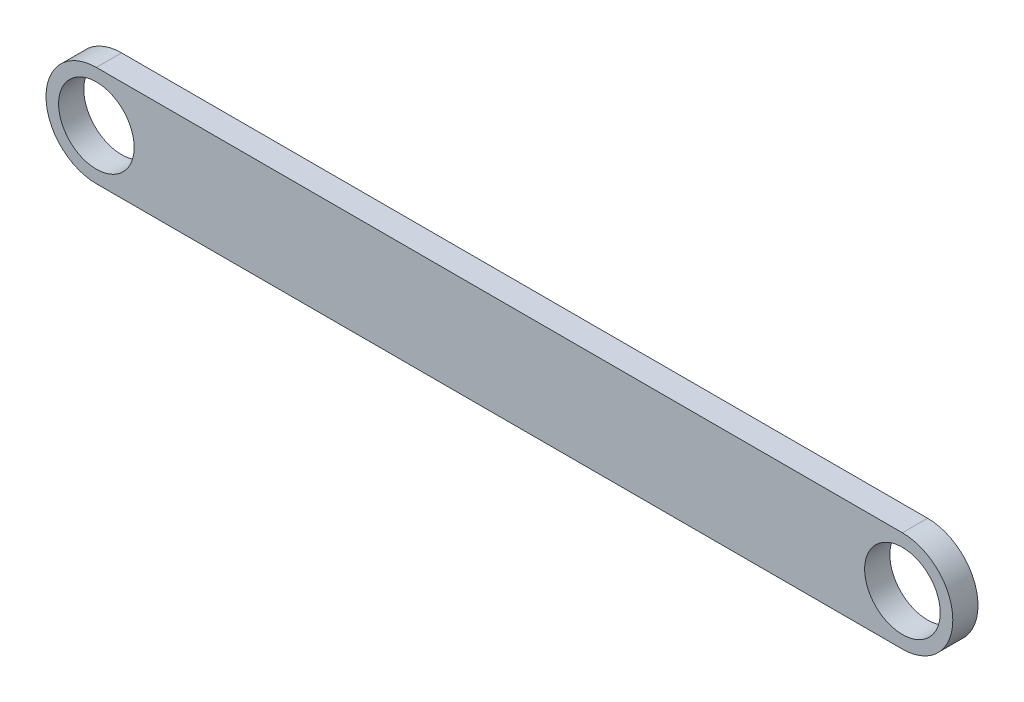
ISO-10303-21;
HEADER;
FILE_DESCRIPTION(('STEP AP214'),'2;1');
FILE_NAME('part.step','',(''),(''),'','','');
FILE_SCHEMA(('AUTOMOTIVE_DESIGN { 1 0 10303 214 1 1 1 1 }'));
ENDSEC;
DATA;
#1=APPLICATION_CONTEXT('core data for automotive mechanical design processes');
#2=APPLICATION_PROTOCOL_DEFINITION('international standard','automotive_design',2000,#1);
#3=PRODUCT_CONTEXT('',#1,'mechanical');
#4=PRODUCT('Part','Part','',(#3));
#5=PRODUCT_RELATED_PRODUCT_CATEGORY('part','',(#4));
#6=PRODUCT_DEFINITION_FORMATION('','',#4);
#7=PRODUCT_DEFINITION_CONTEXT('part definition',#1,'design');
#8=PRODUCT_DEFINITION('design','',#6,#7);
#9=PRODUCT_DEFINITION_SHAPE('','',#8);
#10=(LENGTH_UNIT() NAMED_UNIT(*) SI_UNIT(.MILLI.,.METRE.));
#11=(NAMED_UNIT(*) PLANE_ANGLE_UNIT() SI_UNIT($,.RADIAN.));
#12=(NAMED_UNIT(*) SI_UNIT($,.STERADIAN.) SOLID_ANGLE_UNIT());
#13=UNCERTAINTY_MEASURE_WITH_UNIT(LENGTH_MEASURE(1.E-05),#10,'distance_accuracy_value','');
#14=(GEOMETRIC_REPRESENTATION_CONTEXT(3) GLOBAL_UNCERTAINTY_ASSIGNED_CONTEXT((#13)) GLOBAL_UNIT_ASSIGNED_CONTEXT((#10,
#11,#12)) REPRESENTATION_CONTEXT('',''));
#15=CARTESIAN_POINT('',(0.,0.,0.));
#16=DIRECTION('',(0.,0.,1.));
#17=DIRECTION('',(1.,0.,0.));
#18=AXIS2_PLACEMENT_3D('',#15,#16,#17);
#19=CARTESIAN_POINT('',(0.,0.,10.));
#20=DIRECTION('',(0.,0.,1.));
#21=DIRECTION('',(1.,0.,0.));
#22=AXIS2_PLACEMENT_3D('',#19,#20,#21);
#23=PLANE('',#22);
#24=CARTESIAN_POINT('',(0.,0.,10.));
#25=DIRECTION('',(0.,0.,1.));
#26=DIRECTION('',(1.,0.,0.));
#27=AXIS2_PLACEMENT_3D('',#24,#25,#26);
#28=CIRCLE('',#27,15.);
#29=CARTESIAN_POINT('',(15.,0.,10.));
#30=VERTEX_POINT('',#29);
#31=EDGE_CURVE('E116',#30,#30,#28,.T.);
#32=ORIENTED_EDGE('',*,*,#31,.F.);
#33=EDGE_LOOP('',(#32));
#34=FACE_BOUND('',#33,.T.);
#35=CARTESIAN_POINT('',(0.,0.,10.));
#36=DIRECTION('',(0.,0.,1.));
#37=DIRECTION('',(1.,0.,0.));
#38=AXIS2_PLACEMENT_3D('',#35,#36,#37);
#39=CIRCLE('',#38,20.);
#40=CARTESIAN_POINT('',(0.,20.,10.));
#41=VERTEX_POINT('',#40);
#42=CARTESIAN_POINT('',(0.,-20.,10.));
#43=VERTEX_POINT('',#42);
#44=EDGE_CURVE('E96',#41,#43,#39,.T.);
#45=ORIENTED_EDGE('',*,*,#44,.T.);
#46=DIRECTION('',(1.,0.,0.));
#47=VECTOR('',#46,1.);
#48=CARTESIAN_POINT('',(0.,-20.,10.));
#49=LINE('',#48,#47);
#50=CARTESIAN_POINT('',(320.,-20.,10.));
#51=VERTEX_POINT('',#50);
#52=EDGE_CURVE('E91',#43,#51,#49,.T.);
#53=ORIENTED_EDGE('',*,*,#52,.T.);
#54=CARTESIAN_POINT('',(320.,0.,10.));
#55=DIRECTION('',(0.,0.,1.));
#56=DIRECTION('',(1.,0.,0.));
#57=AXIS2_PLACEMENT_3D('',#54,#55,#56);
#58=CIRCLE('',#57,20.);
#59=CARTESIAN_POINT('',(320.,20.,10.));
#60=VERTEX_POINT('',#59);
#61=EDGE_CURVE('E94',#51,#60,#58,.T.);
#62=ORIENTED_EDGE('',*,*,#61,.T.);
#63=DIRECTION('',(-1.,0.,0.));
#64=VECTOR('',#63,1.);
#65=CARTESIAN_POINT('',(0.,20.,10.));
#66=LINE('',#65,#64);
#67=EDGE_CURVE('E61',#60,#41,#66,.T.);
#68=ORIENTED_EDGE('',*,*,#67,.T.);
#69=EDGE_LOOP('',(#45,#53,#62,#68));
#70=FACE_BOUND('',#69,.T.);
#71=CARTESIAN_POINT('',(320.,0.,10.));
#72=DIRECTION('',(0.,0.,1.));
#73=DIRECTION('',(1.,0.,0.));
#74=AXIS2_PLACEMENT_3D('',#71,#72,#73);
#75=CIRCLE('',#74,15.);
#76=CARTESIAN_POINT('',(335.,0.,10.));
#77=VERTEX_POINT('',#76);
#78=EDGE_CURVE('E138',#77,#77,#75,.T.);
#79=ORIENTED_EDGE('',*,*,#78,.F.);
#80=EDGE_LOOP('',(#79));
#81=FACE_BOUND('',#80,.T.);
#82=ADVANCED_FACE('F43',(#34,#70,#81),#23,.T.);
#83=CARTESIAN_POINT('',(0.,0.,0.));
#84=DIRECTION('',(0.,0.,1.));
#85=DIRECTION('',(1.,0.,0.));
#86=AXIS2_PLACEMENT_3D('',#83,#84,#85);
#87=PLANE('',#86);
#88=CARTESIAN_POINT('',(0.,0.,0.));
#89=DIRECTION('',(0.,0.,1.));
#90=DIRECTION('',(1.,0.,0.));
#91=AXIS2_PLACEMENT_3D('',#88,#89,#90);
#92=CIRCLE('',#91,20.);
#93=CARTESIAN_POINT('',(0.,20.,0.));
#94=VERTEX_POINT('',#93);
#95=CARTESIAN_POINT('',(0.,-20.,0.));
#96=VERTEX_POINT('',#95);
#97=EDGE_CURVE('E112',#94,#96,#92,.T.);
#98=ORIENTED_EDGE('',*,*,#97,.F.);
#99=DIRECTION('',(-1.,0.,0.));
#100=VECTOR('',#99,1.);
#101=CARTESIAN_POINT('',(0.,20.,0.));
#102=LINE('',#101,#100);
#103=CARTESIAN_POINT('',(320.,20.,0.));
#104=VERTEX_POINT('',#103);
#105=EDGE_CURVE('E84',#104,#94,#102,.T.);
#106=ORIENTED_EDGE('',*,*,#105,.F.);
#107=CARTESIAN_POINT('',(320.,0.,0.));
#108=DIRECTION('',(0.,0.,1.));
#109=DIRECTION('',(1.,0.,0.));
#110=AXIS2_PLACEMENT_3D('',#107,#108,#109);
#111=CIRCLE('',#110,20.);
#112=CARTESIAN_POINT('',(320.,-20.,0.));
#113=VERTEX_POINT('',#112);
#114=EDGE_CURVE('E78',#113,#104,#111,.T.);
#115=ORIENTED_EDGE('',*,*,#114,.F.);
#116=DIRECTION('',(1.,0.,0.));
#117=VECTOR('',#116,1.);
#118=CARTESIAN_POINT('',(0.,-20.,0.));
#119=LINE('',#118,#117);
#120=EDGE_CURVE('E101',#96,#113,#119,.T.);
#121=ORIENTED_EDGE('',*,*,#120,.F.);
#122=EDGE_LOOP('',(#98,#106,#115,#121));
#123=FACE_BOUND('',#122,.T.);
#124=CARTESIAN_POINT('',(0.,0.,0.));
#125=DIRECTION('',(0.,0.,1.));
#126=DIRECTION('',(1.,0.,0.));
#127=AXIS2_PLACEMENT_3D('',#124,#125,#126);
#128=CIRCLE('',#127,15.);
#129=CARTESIAN_POINT('',(15.,0.,0.));
#130=VERTEX_POINT('',#129);
#131=EDGE_CURVE('E134',#130,#130,#128,.T.);
#132=ORIENTED_EDGE('',*,*,#131,.T.);
#133=EDGE_LOOP('',(#132));
#134=FACE_BOUND('',#133,.T.);
#135=CARTESIAN_POINT('',(320.,0.,0.));
#136=DIRECTION('',(0.,0.,1.));
#137=DIRECTION('',(1.,0.,0.));
#138=AXIS2_PLACEMENT_3D('',#135,#136,#137);
#139=CIRCLE('',#138,15.);
#140=CARTESIAN_POINT('',(335.,0.,0.));
#141=VERTEX_POINT('',#140);
#142=EDGE_CURVE('E142',#141,#141,#139,.T.);
#143=ORIENTED_EDGE('',*,*,#142,.T.);
#144=EDGE_LOOP('',(#143));
#145=FACE_BOUND('',#144,.T.);
#146=ADVANCED_FACE('F129',(#123,#134,#145),#87,.F.);
#147=CARTESIAN_POINT('',(0.,0.,10.));
#148=DIRECTION('',(0.,0.,-1.));
#149=DIRECTION('',(-1.,0.,0.));
#150=AXIS2_PLACEMENT_3D('',#147,#148,#149);
#151=CYLINDRICAL_SURFACE('',#150,20.);
#152=ORIENTED_EDGE('',*,*,#97,.T.);
#153=DIRECTION('',(0.,0.,-1.));
#154=VECTOR('',#153,1.);
#155=CARTESIAN_POINT('',(0.,-20.,10.));
#156=LINE('',#155,#154);
#157=EDGE_CURVE('E11',#43,#96,#156,.T.);
#158=ORIENTED_EDGE('',*,*,#157,.F.);
#159=ORIENTED_EDGE('',*,*,#44,.F.);
#160=DIRECTION('',(0.,0.,-1.));
#161=VECTOR('',#160,1.);
#162=CARTESIAN_POINT('',(0.,20.,10.));
#163=LINE('',#162,#161);
#164=EDGE_CURVE('E108',#41,#94,#163,.T.);
#165=ORIENTED_EDGE('',*,*,#164,.T.);
#166=EDGE_LOOP('',(#152,#158,#159,#165));
#167=FACE_BOUND('',#166,.T.);
#168=ADVANCED_FACE('F45',(#167),#151,.T.);
#169=CARTESIAN_POINT('',(0.,-20.,10.));
#170=DIRECTION('',(0.,1.,0.));
#171=DIRECTION('',(0.,0.,1.));
#172=AXIS2_PLACEMENT_3D('',#169,#170,#171);
#173=PLANE('',#172);
#174=ORIENTED_EDGE('',*,*,#120,.T.);
#175=DIRECTION('',(0.,0.,-1.));
#176=VECTOR('',#175,1.);
#177=CARTESIAN_POINT('',(320.,-20.,10.));
#178=LINE('',#177,#176);
#179=EDGE_CURVE('E53',#51,#113,#178,.T.);
#180=ORIENTED_EDGE('',*,*,#179,.F.);
#181=ORIENTED_EDGE('',*,*,#52,.F.);
#182=ORIENTED_EDGE('',*,*,#157,.T.);
#183=EDGE_LOOP('',(#174,#180,#181,#182));
#184=FACE_BOUND('',#183,.T.);
#185=ADVANCED_FACE('F100',(#184),#173,.F.);
#186=CARTESIAN_POINT('',(320.,0.,10.));
#187=DIRECTION('',(0.,0.,-1.));
#188=DIRECTION('',(-1.,0.,0.));
#189=AXIS2_PLACEMENT_3D('',#186,#187,#188);
#190=CYLINDRICAL_SURFACE('',#189,20.);
#191=ORIENTED_EDGE('',*,*,#114,.T.);
#192=DIRECTION('',(0.,0.,-1.));
#193=VECTOR('',#192,1.);
#194=CARTESIAN_POINT('',(320.,20.,10.));
#195=LINE('',#194,#193);
#196=EDGE_CURVE('E103',#60,#104,#195,.T.);
#197=ORIENTED_EDGE('',*,*,#196,.F.);
#198=ORIENTED_EDGE('',*,*,#61,.F.);
#199=ORIENTED_EDGE('',*,*,#179,.T.);
#200=EDGE_LOOP('',(#191,#197,#198,#199));
#201=FACE_BOUND('',#200,.T.);
#202=ADVANCED_FACE('F104',(#201),#190,.T.);
#203=CARTESIAN_POINT('',(0.,20.,10.));
#204=DIRECTION('',(0.,-1.,0.));
#205=DIRECTION('',(0.,0.,-1.));
#206=AXIS2_PLACEMENT_3D('',#203,#204,#205);
#207=PLANE('',#206);
#208=ORIENTED_EDGE('',*,*,#105,.T.);
#209=ORIENTED_EDGE('',*,*,#164,.F.);
#210=ORIENTED_EDGE('',*,*,#67,.F.);
#211=ORIENTED_EDGE('',*,*,#196,.T.);
#212=EDGE_LOOP('',(#208,#209,#210,#211));
#213=FACE_BOUND('',#212,.T.);
#214=ADVANCED_FACE('F126',(#213),#207,.F.);
#215=CARTESIAN_POINT('',(0.,0.,10.));
#216=DIRECTION('',(0.,0.,-1.));
#217=DIRECTION('',(-1.,0.,0.));
#218=AXIS2_PLACEMENT_3D('',#215,#216,#217);
#219=CYLINDRICAL_SURFACE('',#218,15.);
#220=ORIENTED_EDGE('',*,*,#31,.T.);
#221=EDGE_LOOP('',(#220));
#222=FACE_BOUND('',#221,.T.);
#223=ORIENTED_EDGE('',*,*,#131,.F.);
#224=EDGE_LOOP('',(#223));
#225=FACE_BOUND('',#224,.T.);
#226=ADVANCED_FACE('F161',(#222,#225),#219,.F.);
#227=CARTESIAN_POINT('',(320.,0.,10.));
#228=DIRECTION('',(0.,0.,-1.));
#229=DIRECTION('',(-1.,0.,0.));
#230=AXIS2_PLACEMENT_3D('',#227,#228,#229);
#231=CYLINDRICAL_SURFACE('',#230,15.);
#232=ORIENTED_EDGE('',*,*,#78,.T.);
#233=EDGE_LOOP('',(#232));
#234=FACE_BOUND('',#233,.T.);
#235=ORIENTED_EDGE('',*,*,#142,.F.);
#236=EDGE_LOOP('',(#235));
#237=FACE_BOUND('',#236,.T.);
#238=ADVANCED_FACE('F150',(#234,#237),#231,.F.);
#239=CLOSED_SHELL('',(#82,#146,#168,#185,#202,#214,#226,#238));
#240=MANIFOLD_SOLID_BREP('B2',#239);
#241=ADVANCED_BREP_SHAPE_REPRESENTATION('',(#18,#240),#14);
#242=SHAPE_DEFINITION_REPRESENTATION(#9,#241);
ENDSEC;
END-ISO-10303-21;
